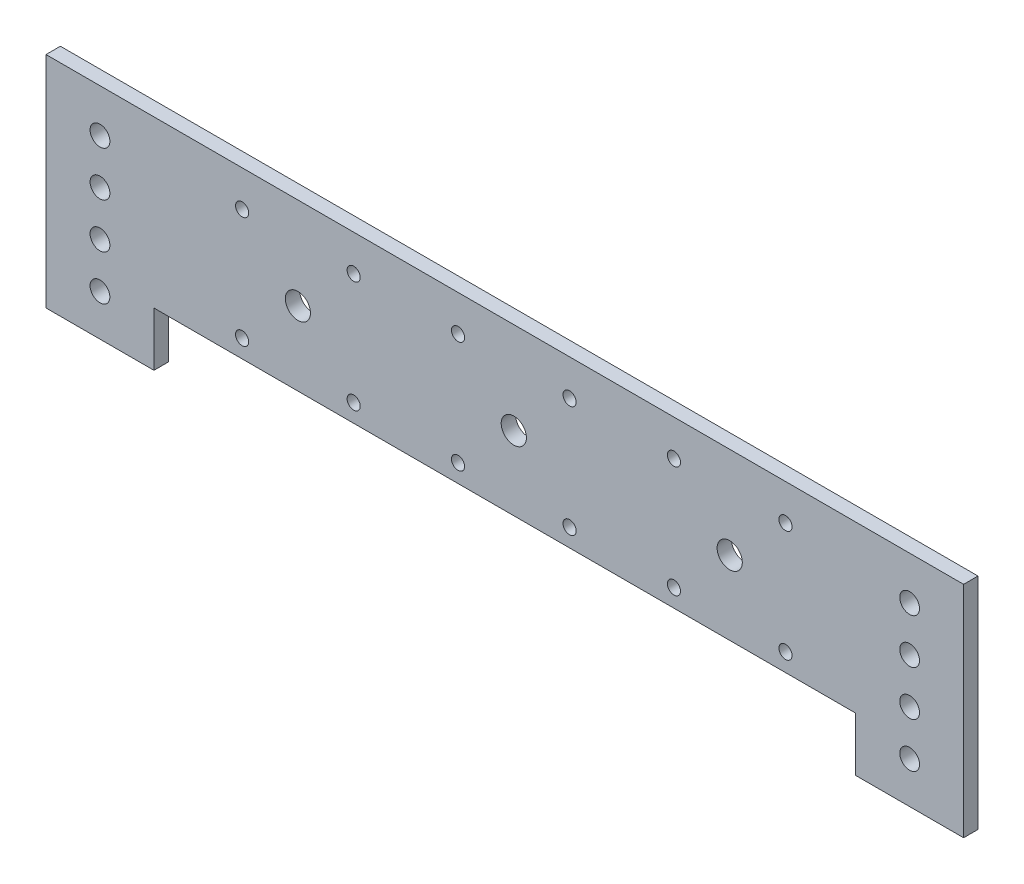
ISO-10303-21;
HEADER;
FILE_DESCRIPTION(('STEP AP214'),'2;1');
FILE_NAME('part.step','',(''),(''),'','','');
FILE_SCHEMA(('AUTOMOTIVE_DESIGN { 1 0 10303 214 1 1 1 1 }'));
ENDSEC;
DATA;
#1=APPLICATION_CONTEXT('core data for automotive mechanical design processes');
#2=APPLICATION_PROTOCOL_DEFINITION('international standard','automotive_design',2000,#1);
#3=PRODUCT_CONTEXT('',#1,'mechanical');
#4=PRODUCT('Part','Part','',(#3));
#5=PRODUCT_RELATED_PRODUCT_CATEGORY('part','',(#4));
#6=PRODUCT_DEFINITION_FORMATION('','',#4);
#7=PRODUCT_DEFINITION_CONTEXT('part definition',#1,'design');
#8=PRODUCT_DEFINITION('design','',#6,#7);
#9=PRODUCT_DEFINITION_SHAPE('','',#8);
#10=(LENGTH_UNIT() NAMED_UNIT(*) SI_UNIT(.MILLI.,.METRE.));
#11=(NAMED_UNIT(*) PLANE_ANGLE_UNIT() SI_UNIT($,.RADIAN.));
#12=(NAMED_UNIT(*) SI_UNIT($,.STERADIAN.) SOLID_ANGLE_UNIT());
#13=UNCERTAINTY_MEASURE_WITH_UNIT(LENGTH_MEASURE(1.E-05),#10,'distance_accuracy_value','');
#14=(GEOMETRIC_REPRESENTATION_CONTEXT(3) GLOBAL_UNCERTAINTY_ASSIGNED_CONTEXT((#13)) GLOBAL_UNIT_ASSIGNED_CONTEXT((#10,
#11,#12)) REPRESENTATION_CONTEXT('',''));
#15=CARTESIAN_POINT('',(0.,0.,0.));
#16=DIRECTION('',(0.,0.,1.));
#17=DIRECTION('',(1.,0.,0.));
#18=AXIS2_PLACEMENT_3D('',#15,#16,#17);
#19=CARTESIAN_POINT('',(0.,-23.,4.));
#20=DIRECTION('',(0.,-1.,0.));
#21=DIRECTION('',(0.,0.,-1.));
#22=AXIS2_PLACEMENT_3D('',#19,#20,#21);
#23=PLANE('',#22);
#24=DIRECTION('',(-1.,0.,0.));
#25=VECTOR('',#24,1.);
#26=CARTESIAN_POINT('',(0.,-23.,0.));
#27=LINE('',#26,#25);
#28=CARTESIAN_POINT('',(95.,-23.,0.));
#29=VERTEX_POINT('',#28);
#30=CARTESIAN_POINT('',(-100.,-23.,0.));
#31=VERTEX_POINT('',#30);
#32=EDGE_CURVE('E54',#29,#31,#27,.T.);
#33=ORIENTED_EDGE('',*,*,#32,.F.);
#34=DIRECTION('',(0.,0.,1.));
#35=VECTOR('',#34,1.);
#36=CARTESIAN_POINT('',(95.,-23.,-78.5573039252239));
#37=LINE('',#36,#35);
#38=CARTESIAN_POINT('',(95.,-23.,4.));
#39=VERTEX_POINT('',#38);
#40=EDGE_CURVE('E121',#29,#39,#37,.T.);
#41=ORIENTED_EDGE('',*,*,#40,.T.);
#42=DIRECTION('',(-1.,0.,0.));
#43=VECTOR('',#42,1.);
#44=CARTESIAN_POINT('',(0.,-23.,4.));
#45=LINE('',#44,#43);
#46=CARTESIAN_POINT('',(-100.,-23.,4.));
#47=VERTEX_POINT('',#46);
#48=EDGE_CURVE('E104',#39,#47,#45,.T.);
#49=ORIENTED_EDGE('',*,*,#48,.T.);
#50=DIRECTION('',(0.,0.,1.));
#51=VECTOR('',#50,1.);
#52=CARTESIAN_POINT('',(-100.,-23.,-78.5573039252239));
#53=LINE('',#52,#51);
#54=EDGE_CURVE('E166',#31,#47,#53,.T.);
#55=ORIENTED_EDGE('',*,*,#54,.F.);
#56=EDGE_LOOP('',(#33,#41,#49,#55));
#57=FACE_BOUND('',#56,.T.);
#58=ADVANCED_FACE('F37',(#57),#23,.T.);
#59=CARTESIAN_POINT('',(75.5,-18.,4.));
#60=DIRECTION('',(0.,0.,-1.));
#61=DIRECTION('',(-1.,0.,0.));
#62=AXIS2_PLACEMENT_3D('',#59,#60,#61);
#63=CYLINDRICAL_SURFACE('',#62,1.82499999999999);
#64=CARTESIAN_POINT('',(75.5,-18.,4.));
#65=DIRECTION('',(0.,0.,1.));
#66=DIRECTION('',(1.,0.,0.));
#67=AXIS2_PLACEMENT_3D('',#64,#65,#66);
#68=CIRCLE('',#67,1.82499999999999);
#69=CARTESIAN_POINT('',(77.325,-18.,4.));
#70=VERTEX_POINT('',#69);
#71=EDGE_CURVE('E46',#70,#70,#68,.F.);
#72=ORIENTED_EDGE('',*,*,#71,.F.);
#73=EDGE_LOOP('',(#72));
#74=FACE_BOUND('',#73,.T.);
#75=CARTESIAN_POINT('',(75.5,-18.,0.));
#76=DIRECTION('',(0.,0.,1.));
#77=DIRECTION('',(1.,0.,0.));
#78=AXIS2_PLACEMENT_3D('',#75,#76,#77);
#79=CIRCLE('',#78,1.82499999999999);
#80=CARTESIAN_POINT('',(77.325,-18.,0.));
#81=VERTEX_POINT('',#80);
#82=EDGE_CURVE('E254',#81,#81,#79,.F.);
#83=ORIENTED_EDGE('',*,*,#82,.T.);
#84=EDGE_LOOP('',(#83));
#85=FACE_BOUND('',#84,.T.);
#86=ADVANCED_FACE('F281',(#74,#85),#63,.F.);
#87=CARTESIAN_POINT('',(60.,-2.49999999999996,4.));
#88=DIRECTION('',(0.,0.,-1.));
#89=DIRECTION('',(-1.,0.,0.));
#90=AXIS2_PLACEMENT_3D('',#87,#88,#89);
#91=CYLINDRICAL_SURFACE('',#90,3.50000000000001);
#92=CARTESIAN_POINT('',(60.,-2.49999999999996,4.));
#93=DIRECTION('',(0.,0.,1.));
#94=DIRECTION('',(1.,0.,0.));
#95=AXIS2_PLACEMENT_3D('',#92,#93,#94);
#96=CIRCLE('',#95,3.50000000000001);
#97=CARTESIAN_POINT('',(63.5,-2.49999999999996,4.));
#98=VERTEX_POINT('',#97);
#99=EDGE_CURVE('E209',#98,#98,#96,.F.);
#100=ORIENTED_EDGE('',*,*,#99,.F.);
#101=EDGE_LOOP('',(#100));
#102=FACE_BOUND('',#101,.T.);
#103=CARTESIAN_POINT('',(60.,-2.49999999999996,0.));
#104=DIRECTION('',(0.,0.,1.));
#105=DIRECTION('',(1.,0.,0.));
#106=AXIS2_PLACEMENT_3D('',#103,#104,#105);
#107=CIRCLE('',#106,3.50000000000001);
#108=CARTESIAN_POINT('',(63.5,-2.49999999999996,0.));
#109=VERTEX_POINT('',#108);
#110=EDGE_CURVE('E252',#109,#109,#107,.F.);
#111=ORIENTED_EDGE('',*,*,#110,.T.);
#112=EDGE_LOOP('',(#111));
#113=FACE_BOUND('',#112,.T.);
#114=ADVANCED_FACE('F286',(#102,#113),#91,.F.);
#115=CARTESIAN_POINT('',(-44.5,-18.,4.));
#116=DIRECTION('',(0.,0.,-1.));
#117=DIRECTION('',(-1.,0.,0.));
#118=AXIS2_PLACEMENT_3D('',#115,#116,#117);
#119=CYLINDRICAL_SURFACE('',#118,1.825);
#120=CARTESIAN_POINT('',(-44.5,-18.,4.));
#121=DIRECTION('',(0.,0.,1.));
#122=DIRECTION('',(1.,0.,0.));
#123=AXIS2_PLACEMENT_3D('',#120,#121,#122);
#124=CIRCLE('',#123,1.825);
#125=CARTESIAN_POINT('',(-42.675,-18.,4.));
#126=VERTEX_POINT('',#125);
#127=EDGE_CURVE('E206',#126,#126,#124,.T.);
#128=ORIENTED_EDGE('',*,*,#127,.T.);
#129=EDGE_LOOP('',(#128));
#130=FACE_BOUND('',#129,.T.);
#131=CARTESIAN_POINT('',(-44.5,-18.,0.));
#132=DIRECTION('',(0.,0.,1.));
#133=DIRECTION('',(1.,0.,0.));
#134=AXIS2_PLACEMENT_3D('',#131,#132,#133);
#135=CIRCLE('',#134,1.825);
#136=CARTESIAN_POINT('',(-42.675,-18.,0.));
#137=VERTEX_POINT('',#136);
#138=EDGE_CURVE('E249',#137,#137,#135,.T.);
#139=ORIENTED_EDGE('',*,*,#138,.F.);
#140=EDGE_LOOP('',(#139));
#141=FACE_BOUND('',#140,.T.);
#142=ADVANCED_FACE('F352',(#130,#141),#119,.F.);
#143=CARTESIAN_POINT('',(-75.5,-18.,4.));
#144=DIRECTION('',(0.,0.,-1.));
#145=DIRECTION('',(-1.,0.,0.));
#146=AXIS2_PLACEMENT_3D('',#143,#144,#145);
#147=CYLINDRICAL_SURFACE('',#146,1.82499999999999);
#148=CARTESIAN_POINT('',(-75.5,-18.,4.));
#149=DIRECTION('',(0.,0.,1.));
#150=DIRECTION('',(1.,0.,0.));
#151=AXIS2_PLACEMENT_3D('',#148,#149,#150);
#152=CIRCLE('',#151,1.82499999999999);
#153=CARTESIAN_POINT('',(-73.675,-18.,4.));
#154=VERTEX_POINT('',#153);
#155=EDGE_CURVE('E203',#154,#154,#152,.T.);
#156=ORIENTED_EDGE('',*,*,#155,.T.);
#157=EDGE_LOOP('',(#156));
#158=FACE_BOUND('',#157,.T.);
#159=CARTESIAN_POINT('',(-75.5,-18.,0.));
#160=DIRECTION('',(0.,0.,1.));
#161=DIRECTION('',(1.,0.,0.));
#162=AXIS2_PLACEMENT_3D('',#159,#160,#161);
#163=CIRCLE('',#162,1.82499999999999);
#164=CARTESIAN_POINT('',(-73.675,-18.,0.));
#165=VERTEX_POINT('',#164);
#166=EDGE_CURVE('E246',#165,#165,#163,.T.);
#167=ORIENTED_EDGE('',*,*,#166,.F.);
#168=EDGE_LOOP('',(#167));
#169=FACE_BOUND('',#168,.T.);
#170=ADVANCED_FACE('F358',(#158,#169),#147,.F.);
#171=CARTESIAN_POINT('',(-44.5,13.,4.));
#172=DIRECTION('',(0.,0.,-1.));
#173=DIRECTION('',(-1.,0.,0.));
#174=AXIS2_PLACEMENT_3D('',#171,#172,#173);
#175=CYLINDRICAL_SURFACE('',#174,1.825);
#176=CARTESIAN_POINT('',(-44.5,13.,4.));
#177=DIRECTION('',(0.,0.,1.));
#178=DIRECTION('',(1.,0.,0.));
#179=AXIS2_PLACEMENT_3D('',#176,#177,#178);
#180=CIRCLE('',#179,1.825);
#181=CARTESIAN_POINT('',(-42.675,13.,4.));
#182=VERTEX_POINT('',#181);
#183=EDGE_CURVE('E200',#182,#182,#180,.T.);
#184=ORIENTED_EDGE('',*,*,#183,.T.);
#185=EDGE_LOOP('',(#184));
#186=FACE_BOUND('',#185,.T.);
#187=CARTESIAN_POINT('',(-44.5,13.,0.));
#188=DIRECTION('',(0.,0.,1.));
#189=DIRECTION('',(1.,0.,0.));
#190=AXIS2_PLACEMENT_3D('',#187,#188,#189);
#191=CIRCLE('',#190,1.825);
#192=CARTESIAN_POINT('',(-42.675,13.,0.));
#193=VERTEX_POINT('',#192);
#194=EDGE_CURVE('E243',#193,#193,#191,.T.);
#195=ORIENTED_EDGE('',*,*,#194,.F.);
#196=EDGE_LOOP('',(#195));
#197=FACE_BOUND('',#196,.T.);
#198=ADVANCED_FACE('F365',(#186,#197),#175,.F.);
#199=CARTESIAN_POINT('',(-75.5,13.,4.));
#200=DIRECTION('',(0.,0.,-1.));
#201=DIRECTION('',(-1.,0.,0.));
#202=AXIS2_PLACEMENT_3D('',#199,#200,#201);
#203=CYLINDRICAL_SURFACE('',#202,1.82499999999999);
#204=CARTESIAN_POINT('',(-75.5,13.,4.));
#205=DIRECTION('',(0.,0.,1.));
#206=DIRECTION('',(1.,0.,0.));
#207=AXIS2_PLACEMENT_3D('',#204,#205,#206);
#208=CIRCLE('',#207,1.82499999999999);
#209=CARTESIAN_POINT('',(-73.675,13.,4.));
#210=VERTEX_POINT('',#209);
#211=EDGE_CURVE('E197',#210,#210,#208,.T.);
#212=ORIENTED_EDGE('',*,*,#211,.T.);
#213=EDGE_LOOP('',(#212));
#214=FACE_BOUND('',#213,.T.);
#215=CARTESIAN_POINT('',(-75.5,13.,0.));
#216=DIRECTION('',(0.,0.,1.));
#217=DIRECTION('',(1.,0.,0.));
#218=AXIS2_PLACEMENT_3D('',#215,#216,#217);
#219=CIRCLE('',#218,1.82499999999999);
#220=CARTESIAN_POINT('',(-73.675,13.,0.));
#221=VERTEX_POINT('',#220);
#222=EDGE_CURVE('E240',#221,#221,#219,.T.);
#223=ORIENTED_EDGE('',*,*,#222,.F.);
#224=EDGE_LOOP('',(#223));
#225=FACE_BOUND('',#224,.T.);
#226=ADVANCED_FACE('F368',(#214,#225),#203,.F.);
#227=CARTESIAN_POINT('',(0.,23.,4.));
#228=DIRECTION('',(0.,-1.,0.));
#229=DIRECTION('',(0.,0.,-1.));
#230=AXIS2_PLACEMENT_3D('',#227,#228,#229);
#231=PLANE('',#230);
#232=DIRECTION('',(-1.,0.,0.));
#233=VECTOR('',#232,1.);
#234=CARTESIAN_POINT('',(0.,23.,0.));
#235=LINE('',#234,#233);
#236=CARTESIAN_POINT('',(125.,23.,0.));
#237=VERTEX_POINT('',#236);
#238=CARTESIAN_POINT('',(-130.,23.,0.));
#239=VERTEX_POINT('',#238);
#240=EDGE_CURVE('E238',#237,#239,#235,.T.);
#241=ORIENTED_EDGE('',*,*,#240,.T.);
#242=DIRECTION('',(0.,0.,1.));
#243=VECTOR('',#242,1.);
#244=CARTESIAN_POINT('',(-130.,23.,-78.5573039252239));
#245=LINE('',#244,#243);
#246=CARTESIAN_POINT('',(-130.,23.,4.));
#247=VERTEX_POINT('',#246);
#248=EDGE_CURVE('E156',#239,#247,#245,.T.);
#249=ORIENTED_EDGE('',*,*,#248,.T.);
#250=DIRECTION('',(-1.,0.,0.));
#251=VECTOR('',#250,1.);
#252=CARTESIAN_POINT('',(0.,23.,4.));
#253=LINE('',#252,#251);
#254=CARTESIAN_POINT('',(125.,23.,4.));
#255=VERTEX_POINT('',#254);
#256=EDGE_CURVE('E117',#255,#247,#253,.T.);
#257=ORIENTED_EDGE('',*,*,#256,.F.);
#258=DIRECTION('',(0.,0.,1.));
#259=VECTOR('',#258,1.);
#260=CARTESIAN_POINT('',(125.,23.,-78.5573039252239));
#261=LINE('',#260,#259);
#262=EDGE_CURVE('E143',#237,#255,#261,.T.);
#263=ORIENTED_EDGE('',*,*,#262,.F.);
#264=EDGE_LOOP('',(#241,#249,#257,#263));
#265=FACE_BOUND('',#264,.T.);
#266=ADVANCED_FACE('F291',(#265),#231,.F.);
#267=CARTESIAN_POINT('',(-15.5,13.,4.));
#268=DIRECTION('',(0.,0.,-1.));
#269=DIRECTION('',(-1.,0.,0.));
#270=AXIS2_PLACEMENT_3D('',#267,#268,#269);
#271=CYLINDRICAL_SURFACE('',#270,1.82499999999999);
#272=CARTESIAN_POINT('',(-15.5,13.,4.));
#273=DIRECTION('',(0.,0.,1.));
#274=DIRECTION('',(1.,0.,0.));
#275=AXIS2_PLACEMENT_3D('',#272,#273,#274);
#276=CIRCLE('',#275,1.82499999999999);
#277=CARTESIAN_POINT('',(-13.675,13.,4.));
#278=VERTEX_POINT('',#277);
#279=EDGE_CURVE('E118',#278,#278,#276,.T.);
#280=ORIENTED_EDGE('',*,*,#279,.T.);
#281=EDGE_LOOP('',(#280));
#282=FACE_BOUND('',#281,.T.);
#283=CARTESIAN_POINT('',(-15.5,13.,0.));
#284=DIRECTION('',(0.,0.,1.));
#285=DIRECTION('',(1.,0.,0.));
#286=AXIS2_PLACEMENT_3D('',#283,#284,#285);
#287=CIRCLE('',#286,1.82499999999999);
#288=CARTESIAN_POINT('',(-13.675,13.,0.));
#289=VERTEX_POINT('',#288);
#290=EDGE_CURVE('E234',#289,#289,#287,.T.);
#291=ORIENTED_EDGE('',*,*,#290,.F.);
#292=EDGE_LOOP('',(#291));
#293=FACE_BOUND('',#292,.T.);
#294=ADVANCED_FACE('F293',(#282,#293),#271,.F.);
#295=CARTESIAN_POINT('',(15.5,13.,4.));
#296=DIRECTION('',(0.,0.,-1.));
#297=DIRECTION('',(-1.,0.,0.));
#298=AXIS2_PLACEMENT_3D('',#295,#296,#297);
#299=CYLINDRICAL_SURFACE('',#298,1.82499999999998);
#300=CARTESIAN_POINT('',(15.5,13.,4.));
#301=DIRECTION('',(0.,0.,1.));
#302=DIRECTION('',(1.,0.,0.));
#303=AXIS2_PLACEMENT_3D('',#300,#301,#302);
#304=CIRCLE('',#303,1.82499999999998);
#305=CARTESIAN_POINT('',(17.325,13.,4.));
#306=VERTEX_POINT('',#305);
#307=EDGE_CURVE('E191',#306,#306,#304,.T.);
#308=ORIENTED_EDGE('',*,*,#307,.T.);
#309=EDGE_LOOP('',(#308));
#310=FACE_BOUND('',#309,.T.);
#311=CARTESIAN_POINT('',(15.5,13.,0.));
#312=DIRECTION('',(0.,0.,1.));
#313=DIRECTION('',(1.,0.,0.));
#314=AXIS2_PLACEMENT_3D('',#311,#312,#313);
#315=CIRCLE('',#314,1.82499999999998);
#316=CARTESIAN_POINT('',(17.325,13.,0.));
#317=VERTEX_POINT('',#316);
#318=EDGE_CURVE('E231',#317,#317,#315,.T.);
#319=ORIENTED_EDGE('',*,*,#318,.F.);
#320=EDGE_LOOP('',(#319));
#321=FACE_BOUND('',#320,.T.);
#322=ADVANCED_FACE('F296',(#310,#321),#299,.F.);
#323=CARTESIAN_POINT('',(-15.5,-18.,4.));
#324=DIRECTION('',(0.,0.,-1.));
#325=DIRECTION('',(-1.,0.,0.));
#326=AXIS2_PLACEMENT_3D('',#323,#324,#325);
#327=CYLINDRICAL_SURFACE('',#326,1.82499999999999);
#328=CARTESIAN_POINT('',(-15.5,-18.,4.));
#329=DIRECTION('',(0.,0.,1.));
#330=DIRECTION('',(1.,0.,0.));
#331=AXIS2_PLACEMENT_3D('',#328,#329,#330);
#332=CIRCLE('',#331,1.82499999999999);
#333=CARTESIAN_POINT('',(-13.675,-18.,4.));
#334=VERTEX_POINT('',#333);
#335=EDGE_CURVE('E188',#334,#334,#332,.T.);
#336=ORIENTED_EDGE('',*,*,#335,.T.);
#337=EDGE_LOOP('',(#336));
#338=FACE_BOUND('',#337,.T.);
#339=CARTESIAN_POINT('',(-15.5,-18.,0.));
#340=DIRECTION('',(0.,0.,1.));
#341=DIRECTION('',(1.,0.,0.));
#342=AXIS2_PLACEMENT_3D('',#339,#340,#341);
#343=CIRCLE('',#342,1.82499999999999);
#344=CARTESIAN_POINT('',(-13.675,-18.,0.));
#345=VERTEX_POINT('',#344);
#346=EDGE_CURVE('E228',#345,#345,#343,.T.);
#347=ORIENTED_EDGE('',*,*,#346,.F.);
#348=EDGE_LOOP('',(#347));
#349=FACE_BOUND('',#348,.T.);
#350=ADVANCED_FACE('F300',(#338,#349),#327,.F.);
#351=CARTESIAN_POINT('',(15.5,-18.,4.));
#352=DIRECTION('',(0.,0.,-1.));
#353=DIRECTION('',(-1.,0.,0.));
#354=AXIS2_PLACEMENT_3D('',#351,#352,#353);
#355=CYLINDRICAL_SURFACE('',#354,1.82499999999998);
#356=CARTESIAN_POINT('',(15.5,-18.,4.));
#357=DIRECTION('',(0.,0.,1.));
#358=DIRECTION('',(1.,0.,0.));
#359=AXIS2_PLACEMENT_3D('',#356,#357,#358);
#360=CIRCLE('',#359,1.82499999999998);
#361=CARTESIAN_POINT('',(17.325,-18.,4.));
#362=VERTEX_POINT('',#361);
#363=EDGE_CURVE('E185',#362,#362,#360,.T.);
#364=ORIENTED_EDGE('',*,*,#363,.T.);
#365=EDGE_LOOP('',(#364));
#366=FACE_BOUND('',#365,.T.);
#367=CARTESIAN_POINT('',(15.5,-18.,0.));
#368=DIRECTION('',(0.,0.,1.));
#369=DIRECTION('',(1.,0.,0.));
#370=AXIS2_PLACEMENT_3D('',#367,#368,#369);
#371=CIRCLE('',#370,1.82499999999998);
#372=CARTESIAN_POINT('',(17.325,-18.,0.));
#373=VERTEX_POINT('',#372);
#374=EDGE_CURVE('E225',#373,#373,#371,.T.);
#375=ORIENTED_EDGE('',*,*,#374,.F.);
#376=EDGE_LOOP('',(#375));
#377=FACE_BOUND('',#376,.T.);
#378=ADVANCED_FACE('F304',(#366,#377),#355,.F.);
#379=CARTESIAN_POINT('',(44.5,-18.,4.));
#380=DIRECTION('',(0.,0.,-1.));
#381=DIRECTION('',(-1.,0.,0.));
#382=AXIS2_PLACEMENT_3D('',#379,#380,#381);
#383=CYLINDRICAL_SURFACE('',#382,1.825);
#384=CARTESIAN_POINT('',(44.5,-18.,4.));
#385=DIRECTION('',(0.,0.,1.));
#386=DIRECTION('',(1.,0.,0.));
#387=AXIS2_PLACEMENT_3D('',#384,#385,#386);
#388=CIRCLE('',#387,1.825);
#389=CARTESIAN_POINT('',(46.325,-18.,4.));
#390=VERTEX_POINT('',#389);
#391=EDGE_CURVE('E182',#390,#390,#388,.F.);
#392=ORIENTED_EDGE('',*,*,#391,.F.);
#393=EDGE_LOOP('',(#392));
#394=FACE_BOUND('',#393,.T.);
#395=CARTESIAN_POINT('',(44.5,-18.,0.));
#396=DIRECTION('',(0.,0.,1.));
#397=DIRECTION('',(1.,0.,0.));
#398=AXIS2_PLACEMENT_3D('',#395,#396,#397);
#399=CIRCLE('',#398,1.825);
#400=CARTESIAN_POINT('',(46.325,-18.,0.));
#401=VERTEX_POINT('',#400);
#402=EDGE_CURVE('E222',#401,#401,#399,.F.);
#403=ORIENTED_EDGE('',*,*,#402,.T.);
#404=EDGE_LOOP('',(#403));
#405=FACE_BOUND('',#404,.T.);
#406=ADVANCED_FACE('F308',(#394,#405),#383,.F.);
#407=CARTESIAN_POINT('',(-60.,-2.5,4.));
#408=DIRECTION('',(0.,0.,-1.));
#409=DIRECTION('',(-1.,0.,0.));
#410=AXIS2_PLACEMENT_3D('',#407,#408,#409);
#411=CYLINDRICAL_SURFACE('',#410,3.50000000000001);
#412=CARTESIAN_POINT('',(-60.,-2.5,4.));
#413=DIRECTION('',(0.,0.,1.));
#414=DIRECTION('',(1.,0.,0.));
#415=AXIS2_PLACEMENT_3D('',#412,#413,#414);
#416=CIRCLE('',#415,3.50000000000001);
#417=CARTESIAN_POINT('',(-56.5,-2.5,4.));
#418=VERTEX_POINT('',#417);
#419=EDGE_CURVE('E179',#418,#418,#416,.T.);
#420=ORIENTED_EDGE('',*,*,#419,.T.);
#421=EDGE_LOOP('',(#420));
#422=FACE_BOUND('',#421,.T.);
#423=CARTESIAN_POINT('',(-60.,-2.5,0.));
#424=DIRECTION('',(0.,0.,1.));
#425=DIRECTION('',(1.,0.,0.));
#426=AXIS2_PLACEMENT_3D('',#423,#424,#425);
#427=CIRCLE('',#426,3.50000000000001);
#428=CARTESIAN_POINT('',(-56.5,-2.5,0.));
#429=VERTEX_POINT('',#428);
#430=EDGE_CURVE('E219',#429,#429,#427,.T.);
#431=ORIENTED_EDGE('',*,*,#430,.F.);
#432=EDGE_LOOP('',(#431));
#433=FACE_BOUND('',#432,.T.);
#434=ADVANCED_FACE('F312',(#422,#433),#411,.F.);
#435=CARTESIAN_POINT('',(0.,-2.50000000000001,4.));
#436=DIRECTION('',(0.,0.,-1.));
#437=DIRECTION('',(-1.,0.,0.));
#438=AXIS2_PLACEMENT_3D('',#435,#436,#437);
#439=CYLINDRICAL_SURFACE('',#438,3.50000000000001);
#440=CARTESIAN_POINT('',(0.,-2.50000000000001,4.));
#441=DIRECTION('',(0.,0.,1.));
#442=DIRECTION('',(1.,0.,0.));
#443=AXIS2_PLACEMENT_3D('',#440,#441,#442);
#444=CIRCLE('',#443,3.50000000000001);
#445=CARTESIAN_POINT('',(3.50000000000001,-2.50000000000001,4.));
#446=VERTEX_POINT('',#445);
#447=EDGE_CURVE('E176',#446,#446,#444,.T.);
#448=ORIENTED_EDGE('',*,*,#447,.T.);
#449=EDGE_LOOP('',(#448));
#450=FACE_BOUND('',#449,.T.);
#451=CARTESIAN_POINT('',(0.,-2.50000000000001,0.));
#452=DIRECTION('',(0.,0.,1.));
#453=DIRECTION('',(1.,0.,0.));
#454=AXIS2_PLACEMENT_3D('',#451,#452,#453);
#455=CIRCLE('',#454,3.50000000000001);
#456=CARTESIAN_POINT('',(3.50000000000001,-2.50000000000001,0.));
#457=VERTEX_POINT('',#456);
#458=EDGE_CURVE('E216',#457,#457,#455,.T.);
#459=ORIENTED_EDGE('',*,*,#458,.F.);
#460=EDGE_LOOP('',(#459));
#461=FACE_BOUND('',#460,.T.);
#462=ADVANCED_FACE('F315',(#450,#461),#439,.F.);
#463=CARTESIAN_POINT('',(44.5,13.,4.));
#464=DIRECTION('',(0.,0.,-1.));
#465=DIRECTION('',(-1.,0.,0.));
#466=AXIS2_PLACEMENT_3D('',#463,#464,#465);
#467=CYLINDRICAL_SURFACE('',#466,1.825);
#468=CARTESIAN_POINT('',(44.5,13.,4.));
#469=DIRECTION('',(0.,0.,1.));
#470=DIRECTION('',(1.,0.,0.));
#471=AXIS2_PLACEMENT_3D('',#468,#469,#470);
#472=CIRCLE('',#471,1.825);
#473=CARTESIAN_POINT('',(46.325,13.,4.));
#474=VERTEX_POINT('',#473);
#475=EDGE_CURVE('E173',#474,#474,#472,.F.);
#476=ORIENTED_EDGE('',*,*,#475,.F.);
#477=EDGE_LOOP('',(#476));
#478=FACE_BOUND('',#477,.T.);
#479=CARTESIAN_POINT('',(44.5,13.,0.));
#480=DIRECTION('',(0.,0.,1.));
#481=DIRECTION('',(1.,0.,0.));
#482=AXIS2_PLACEMENT_3D('',#479,#480,#481);
#483=CIRCLE('',#482,1.825);
#484=CARTESIAN_POINT('',(46.325,13.,0.));
#485=VERTEX_POINT('',#484);
#486=EDGE_CURVE('E172',#485,#485,#483,.F.);
#487=ORIENTED_EDGE('',*,*,#486,.T.);
#488=EDGE_LOOP('',(#487));
#489=FACE_BOUND('',#488,.T.);
#490=ADVANCED_FACE('F39',(#478,#489),#467,.F.);
#491=CARTESIAN_POINT('',(75.5,13.,4.));
#492=DIRECTION('',(0.,0.,-1.));
#493=DIRECTION('',(-1.,0.,0.));
#494=AXIS2_PLACEMENT_3D('',#491,#492,#493);
#495=CYLINDRICAL_SURFACE('',#494,1.82499999999999);
#496=CARTESIAN_POINT('',(75.5,13.,4.));
#497=DIRECTION('',(0.,0.,1.));
#498=DIRECTION('',(1.,0.,0.));
#499=AXIS2_PLACEMENT_3D('',#496,#497,#498);
#500=CIRCLE('',#499,1.82499999999999);
#501=CARTESIAN_POINT('',(77.325,13.,4.));
#502=VERTEX_POINT('',#501);
#503=EDGE_CURVE('E11',#502,#502,#500,.F.);
#504=ORIENTED_EDGE('',*,*,#503,.F.);
#505=EDGE_LOOP('',(#504));
#506=FACE_BOUND('',#505,.T.);
#507=CARTESIAN_POINT('',(75.5,13.,0.));
#508=DIRECTION('',(0.,0.,1.));
#509=DIRECTION('',(1.,0.,0.));
#510=AXIS2_PLACEMENT_3D('',#507,#508,#509);
#511=CIRCLE('',#510,1.82499999999999);
#512=CARTESIAN_POINT('',(77.325,13.,0.));
#513=VERTEX_POINT('',#512);
#514=EDGE_CURVE('E41',#513,#513,#511,.F.);
#515=ORIENTED_EDGE('',*,*,#514,.T.);
#516=EDGE_LOOP('',(#515));
#517=FACE_BOUND('',#516,.T.);
#518=ADVANCED_FACE('F261',(#506,#517),#495,.F.);
#519=CARTESIAN_POINT('',(0.,0.,4.));
#520=DIRECTION('',(0.,0.,1.));
#521=DIRECTION('',(1.,0.,0.));
#522=AXIS2_PLACEMENT_3D('',#519,#520,#521);
#523=PLANE('',#522);
#524=CARTESIAN_POINT('',(-115.,-1.49999999999999,4.));
#525=DIRECTION('',(0.,0.,1.));
#526=DIRECTION('',(1.,0.,0.));
#527=AXIS2_PLACEMENT_3D('',#524,#525,#526);
#528=CIRCLE('',#527,2.74999999999999);
#529=CARTESIAN_POINT('',(-112.25,-1.49999999999999,4.));
#530=VERTEX_POINT('',#529);
#531=EDGE_CURVE('E566',#530,#530,#528,.T.);
#532=ORIENTED_EDGE('',*,*,#531,.F.);
#533=EDGE_LOOP('',(#532));
#534=FACE_BOUND('',#533,.T.);
#535=CARTESIAN_POINT('',(-115.,-26.5,4.));
#536=DIRECTION('',(0.,0.,1.));
#537=DIRECTION('',(1.,0.,0.));
#538=AXIS2_PLACEMENT_3D('',#535,#536,#537);
#539=CIRCLE('',#538,2.74999999999999);
#540=CARTESIAN_POINT('',(-112.25,-26.5,4.));
#541=VERTEX_POINT('',#540);
#542=EDGE_CURVE('E561',#541,#541,#539,.T.);
#543=ORIENTED_EDGE('',*,*,#542,.F.);
#544=EDGE_LOOP('',(#543));
#545=FACE_BOUND('',#544,.T.);
#546=CARTESIAN_POINT('',(110.,-1.49999999999999,4.));
#547=DIRECTION('',(0.,0.,1.));
#548=DIRECTION('',(1.,0.,0.));
#549=AXIS2_PLACEMENT_3D('',#546,#547,#548);
#550=CIRCLE('',#549,2.74999999999999);
#551=CARTESIAN_POINT('',(112.75,-1.49999999999999,4.));
#552=VERTEX_POINT('',#551);
#553=EDGE_CURVE('E555',#552,#552,#550,.T.);
#554=ORIENTED_EDGE('',*,*,#553,.F.);
#555=EDGE_LOOP('',(#554));
#556=FACE_BOUND('',#555,.T.);
#557=CARTESIAN_POINT('',(110.,-26.5,4.));
#558=DIRECTION('',(0.,0.,1.));
#559=DIRECTION('',(1.,0.,0.));
#560=AXIS2_PLACEMENT_3D('',#557,#558,#559);
#561=CIRCLE('',#560,2.74999999999999);
#562=CARTESIAN_POINT('',(112.75,-26.5,4.));
#563=VERTEX_POINT('',#562);
#564=EDGE_CURVE('E549',#563,#563,#561,.T.);
#565=ORIENTED_EDGE('',*,*,#564,.F.);
#566=EDGE_LOOP('',(#565));
#567=FACE_BOUND('',#566,.T.);
#568=CARTESIAN_POINT('',(-115.,11.,4.));
#569=DIRECTION('',(0.,0.,1.));
#570=DIRECTION('',(1.,0.,0.));
#571=AXIS2_PLACEMENT_3D('',#568,#569,#570);
#572=CIRCLE('',#571,2.74999999999999);
#573=CARTESIAN_POINT('',(-112.25,11.,4.));
#574=VERTEX_POINT('',#573);
#575=EDGE_CURVE('E543',#574,#574,#572,.T.);
#576=ORIENTED_EDGE('',*,*,#575,.F.);
#577=EDGE_LOOP('',(#576));
#578=FACE_BOUND('',#577,.T.);
#579=CARTESIAN_POINT('',(110.,11.,4.));
#580=DIRECTION('',(0.,0.,1.));
#581=DIRECTION('',(1.,0.,0.));
#582=AXIS2_PLACEMENT_3D('',#579,#580,#581);
#583=CIRCLE('',#582,2.74999999999999);
#584=CARTESIAN_POINT('',(112.75,11.,4.));
#585=VERTEX_POINT('',#584);
#586=EDGE_CURVE('E537',#585,#585,#583,.T.);
#587=ORIENTED_EDGE('',*,*,#586,.F.);
#588=EDGE_LOOP('',(#587));
#589=FACE_BOUND('',#588,.T.);
#590=CARTESIAN_POINT('',(110.,-14.,4.));
#591=DIRECTION('',(0.,0.,1.));
#592=DIRECTION('',(1.,0.,0.));
#593=AXIS2_PLACEMENT_3D('',#590,#591,#592);
#594=CIRCLE('',#593,2.74999999999999);
#595=CARTESIAN_POINT('',(112.75,-14.,4.));
#596=VERTEX_POINT('',#595);
#597=EDGE_CURVE('E531',#596,#596,#594,.T.);
#598=ORIENTED_EDGE('',*,*,#597,.F.);
#599=EDGE_LOOP('',(#598));
#600=FACE_BOUND('',#599,.T.);
#601=CARTESIAN_POINT('',(-115.,-14.,4.));
#602=DIRECTION('',(0.,0.,1.));
#603=DIRECTION('',(1.,0.,0.));
#604=AXIS2_PLACEMENT_3D('',#601,#602,#603);
#605=CIRCLE('',#604,2.74999999999999);
#606=CARTESIAN_POINT('',(-112.25,-14.,4.));
#607=VERTEX_POINT('',#606);
#608=EDGE_CURVE('E135',#607,#607,#605,.T.);
#609=ORIENTED_EDGE('',*,*,#608,.F.);
#610=EDGE_LOOP('',(#609));
#611=FACE_BOUND('',#610,.T.);
#612=ORIENTED_EDGE('',*,*,#475,.T.);
#613=EDGE_LOOP('',(#612));
#614=FACE_BOUND('',#613,.T.);
#615=ORIENTED_EDGE('',*,*,#447,.F.);
#616=EDGE_LOOP('',(#615));
#617=FACE_BOUND('',#616,.T.);
#618=ORIENTED_EDGE('',*,*,#419,.F.);
#619=EDGE_LOOP('',(#618));
#620=FACE_BOUND('',#619,.T.);
#621=ORIENTED_EDGE('',*,*,#391,.T.);
#622=EDGE_LOOP('',(#621));
#623=FACE_BOUND('',#622,.T.);
#624=ORIENTED_EDGE('',*,*,#363,.F.);
#625=EDGE_LOOP('',(#624));
#626=FACE_BOUND('',#625,.T.);
#627=ORIENTED_EDGE('',*,*,#335,.F.);
#628=EDGE_LOOP('',(#627));
#629=FACE_BOUND('',#628,.T.);
#630=ORIENTED_EDGE('',*,*,#307,.F.);
#631=EDGE_LOOP('',(#630));
#632=FACE_BOUND('',#631,.T.);
#633=ORIENTED_EDGE('',*,*,#279,.F.);
#634=EDGE_LOOP('',(#633));
#635=FACE_BOUND('',#634,.T.);
#636=ORIENTED_EDGE('',*,*,#256,.T.);
#637=DIRECTION('',(0.,1.,0.));
#638=VECTOR('',#637,1.);
#639=CARTESIAN_POINT('',(-130.,0.,4.));
#640=LINE('',#639,#638);
#641=CARTESIAN_POINT('',(-130.,-38.,4.));
#642=VERTEX_POINT('',#641);
#643=EDGE_CURVE('E152',#642,#247,#640,.T.);
#644=ORIENTED_EDGE('',*,*,#643,.F.);
#645=DIRECTION('',(1.,0.,0.));
#646=VECTOR('',#645,1.);
#647=CARTESIAN_POINT('',(0.,-38.,4.));
#648=LINE('',#647,#646);
#649=CARTESIAN_POINT('',(-100.,-38.,4.));
#650=VERTEX_POINT('',#649);
#651=EDGE_CURVE('E160',#642,#650,#648,.T.);
#652=ORIENTED_EDGE('',*,*,#651,.T.);
#653=DIRECTION('',(0.,-1.,0.));
#654=VECTOR('',#653,1.);
#655=CARTESIAN_POINT('',(-100.,0.,4.));
#656=LINE('',#655,#654);
#657=EDGE_CURVE('E113',#47,#650,#656,.T.);
#658=ORIENTED_EDGE('',*,*,#657,.F.);
#659=ORIENTED_EDGE('',*,*,#48,.F.);
#660=DIRECTION('',(0.,-1.,0.));
#661=VECTOR('',#660,1.);
#662=CARTESIAN_POINT('',(95.,0.,4.));
#663=LINE('',#662,#661);
#664=CARTESIAN_POINT('',(95.,-38.,4.));
#665=VERTEX_POINT('',#664);
#666=EDGE_CURVE('E110',#39,#665,#663,.T.);
#667=ORIENTED_EDGE('',*,*,#666,.T.);
#668=DIRECTION('',(-1.,0.,0.));
#669=VECTOR('',#668,1.);
#670=CARTESIAN_POINT('',(0.,-38.,4.));
#671=LINE('',#670,#669);
#672=CARTESIAN_POINT('',(125.,-38.,4.));
#673=VERTEX_POINT('',#672);
#674=EDGE_CURVE('E130',#673,#665,#671,.T.);
#675=ORIENTED_EDGE('',*,*,#674,.F.);
#676=DIRECTION('',(0.,1.,0.));
#677=VECTOR('',#676,1.);
#678=CARTESIAN_POINT('',(125.,0.,4.));
#679=LINE('',#678,#677);
#680=EDGE_CURVE('E125',#673,#255,#679,.T.);
#681=ORIENTED_EDGE('',*,*,#680,.T.);
#682=EDGE_LOOP('',(#636,#644,#652,#658,#659,#667,#675,#681));
#683=FACE_BOUND('',#682,.T.);
#684=ORIENTED_EDGE('',*,*,#211,.F.);
#685=EDGE_LOOP('',(#684));
#686=FACE_BOUND('',#685,.T.);
#687=ORIENTED_EDGE('',*,*,#183,.F.);
#688=EDGE_LOOP('',(#687));
#689=FACE_BOUND('',#688,.T.);
#690=ORIENTED_EDGE('',*,*,#155,.F.);
#691=EDGE_LOOP('',(#690));
#692=FACE_BOUND('',#691,.T.);
#693=ORIENTED_EDGE('',*,*,#127,.F.);
#694=EDGE_LOOP('',(#693));
#695=FACE_BOUND('',#694,.T.);
#696=ORIENTED_EDGE('',*,*,#99,.T.);
#697=EDGE_LOOP('',(#696));
#698=FACE_BOUND('',#697,.T.);
#699=ORIENTED_EDGE('',*,*,#71,.T.);
#700=EDGE_LOOP('',(#699));
#701=FACE_BOUND('',#700,.T.);
#702=ORIENTED_EDGE('',*,*,#503,.T.);
#703=EDGE_LOOP('',(#702));
#704=FACE_BOUND('',#703,.T.);
#705=ADVANCED_FACE('F106',(#534,#545,#556,#567,#578,#589,#600,#611,#614,#617,#620,#623,#626,
#629,#632,#635,#683,#686,#689,#692,#695,#698,#701,#704),#523,.T.);
#706=CARTESIAN_POINT('',(0.,0.,0.));
#707=DIRECTION('',(0.,0.,1.));
#708=DIRECTION('',(1.,0.,0.));
#709=AXIS2_PLACEMENT_3D('',#706,#707,#708);
#710=PLANE('',#709);
#711=CARTESIAN_POINT('',(-115.,-1.49999999999999,0.));
#712=DIRECTION('',(0.,0.,1.));
#713=DIRECTION('',(1.,0.,0.));
#714=AXIS2_PLACEMENT_3D('',#711,#712,#713);
#715=CIRCLE('',#714,2.75);
#716=CARTESIAN_POINT('',(-112.25,-1.49999999999999,0.));
#717=VERTEX_POINT('',#716);
#718=EDGE_CURVE('E564',#717,#717,#715,.T.);
#719=ORIENTED_EDGE('',*,*,#718,.T.);
#720=EDGE_LOOP('',(#719));
#721=FACE_BOUND('',#720,.T.);
#722=CARTESIAN_POINT('',(-115.,-26.5,0.));
#723=DIRECTION('',(0.,0.,1.));
#724=DIRECTION('',(1.,0.,0.));
#725=AXIS2_PLACEMENT_3D('',#722,#723,#724);
#726=CIRCLE('',#725,2.75);
#727=CARTESIAN_POINT('',(-112.25,-26.5,0.));
#728=VERTEX_POINT('',#727);
#729=EDGE_CURVE('E558',#728,#728,#726,.T.);
#730=ORIENTED_EDGE('',*,*,#729,.T.);
#731=EDGE_LOOP('',(#730));
#732=FACE_BOUND('',#731,.T.);
#733=CARTESIAN_POINT('',(110.,-1.49999999999999,0.));
#734=DIRECTION('',(0.,0.,1.));
#735=DIRECTION('',(1.,0.,0.));
#736=AXIS2_PLACEMENT_3D('',#733,#734,#735);
#737=CIRCLE('',#736,2.75);
#738=CARTESIAN_POINT('',(112.75,-1.49999999999999,0.));
#739=VERTEX_POINT('',#738);
#740=EDGE_CURVE('E552',#739,#739,#737,.T.);
#741=ORIENTED_EDGE('',*,*,#740,.T.);
#742=EDGE_LOOP('',(#741));
#743=FACE_BOUND('',#742,.T.);
#744=CARTESIAN_POINT('',(110.,-26.5,0.));
#745=DIRECTION('',(0.,0.,1.));
#746=DIRECTION('',(1.,0.,0.));
#747=AXIS2_PLACEMENT_3D('',#744,#745,#746);
#748=CIRCLE('',#747,2.75);
#749=CARTESIAN_POINT('',(112.75,-26.5,0.));
#750=VERTEX_POINT('',#749);
#751=EDGE_CURVE('E546',#750,#750,#748,.T.);
#752=ORIENTED_EDGE('',*,*,#751,.T.);
#753=EDGE_LOOP('',(#752));
#754=FACE_BOUND('',#753,.T.);
#755=CARTESIAN_POINT('',(-115.,11.,0.));
#756=DIRECTION('',(0.,0.,1.));
#757=DIRECTION('',(1.,0.,0.));
#758=AXIS2_PLACEMENT_3D('',#755,#756,#757);
#759=CIRCLE('',#758,2.75);
#760=CARTESIAN_POINT('',(-112.25,11.,0.));
#761=VERTEX_POINT('',#760);
#762=EDGE_CURVE('E540',#761,#761,#759,.T.);
#763=ORIENTED_EDGE('',*,*,#762,.T.);
#764=EDGE_LOOP('',(#763));
#765=FACE_BOUND('',#764,.T.);
#766=CARTESIAN_POINT('',(110.,11.,0.));
#767=DIRECTION('',(0.,0.,1.));
#768=DIRECTION('',(1.,0.,0.));
#769=AXIS2_PLACEMENT_3D('',#766,#767,#768);
#770=CIRCLE('',#769,2.75);
#771=CARTESIAN_POINT('',(112.75,11.,0.));
#772=VERTEX_POINT('',#771);
#773=EDGE_CURVE('E534',#772,#772,#770,.T.);
#774=ORIENTED_EDGE('',*,*,#773,.T.);
#775=EDGE_LOOP('',(#774));
#776=FACE_BOUND('',#775,.T.);
#777=CARTESIAN_POINT('',(110.,-14.,0.));
#778=DIRECTION('',(0.,0.,1.));
#779=DIRECTION('',(1.,0.,0.));
#780=AXIS2_PLACEMENT_3D('',#777,#778,#779);
#781=CIRCLE('',#780,2.75);
#782=CARTESIAN_POINT('',(112.75,-14.,0.));
#783=VERTEX_POINT('',#782);
#784=EDGE_CURVE('E528',#783,#783,#781,.T.);
#785=ORIENTED_EDGE('',*,*,#784,.T.);
#786=EDGE_LOOP('',(#785));
#787=FACE_BOUND('',#786,.T.);
#788=CARTESIAN_POINT('',(-115.,-14.,0.));
#789=DIRECTION('',(0.,0.,1.));
#790=DIRECTION('',(1.,0.,0.));
#791=AXIS2_PLACEMENT_3D('',#788,#789,#790);
#792=CIRCLE('',#791,2.75);
#793=CARTESIAN_POINT('',(-112.25,-14.,0.));
#794=VERTEX_POINT('',#793);
#795=EDGE_CURVE('E131',#794,#794,#792,.T.);
#796=ORIENTED_EDGE('',*,*,#795,.T.);
#797=EDGE_LOOP('',(#796));
#798=FACE_BOUND('',#797,.T.);
#799=ORIENTED_EDGE('',*,*,#486,.F.);
#800=EDGE_LOOP('',(#799));
#801=FACE_BOUND('',#800,.T.);
#802=ORIENTED_EDGE('',*,*,#458,.T.);
#803=EDGE_LOOP('',(#802));
#804=FACE_BOUND('',#803,.T.);
#805=ORIENTED_EDGE('',*,*,#430,.T.);
#806=EDGE_LOOP('',(#805));
#807=FACE_BOUND('',#806,.T.);
#808=ORIENTED_EDGE('',*,*,#402,.F.);
#809=EDGE_LOOP('',(#808));
#810=FACE_BOUND('',#809,.T.);
#811=ORIENTED_EDGE('',*,*,#374,.T.);
#812=EDGE_LOOP('',(#811));
#813=FACE_BOUND('',#812,.T.);
#814=ORIENTED_EDGE('',*,*,#346,.T.);
#815=EDGE_LOOP('',(#814));
#816=FACE_BOUND('',#815,.T.);
#817=ORIENTED_EDGE('',*,*,#318,.T.);
#818=EDGE_LOOP('',(#817));
#819=FACE_BOUND('',#818,.T.);
#820=ORIENTED_EDGE('',*,*,#290,.T.);
#821=EDGE_LOOP('',(#820));
#822=FACE_BOUND('',#821,.T.);
#823=ORIENTED_EDGE('',*,*,#32,.T.);
#824=DIRECTION('',(0.,1.,0.));
#825=VECTOR('',#824,1.);
#826=CARTESIAN_POINT('',(-100.,0.,0.));
#827=LINE('',#826,#825);
#828=CARTESIAN_POINT('',(-100.,-38.,0.));
#829=VERTEX_POINT('',#828);
#830=EDGE_CURVE('E153',#829,#31,#827,.T.);
#831=ORIENTED_EDGE('',*,*,#830,.F.);
#832=DIRECTION('',(-1.,0.,0.));
#833=VECTOR('',#832,1.);
#834=CARTESIAN_POINT('',(0.,-38.,0.));
#835=LINE('',#834,#833);
#836=CARTESIAN_POINT('',(-130.,-38.,0.));
#837=VERTEX_POINT('',#836);
#838=EDGE_CURVE('E60',#829,#837,#835,.T.);
#839=ORIENTED_EDGE('',*,*,#838,.T.);
#840=DIRECTION('',(0.,-1.,0.));
#841=VECTOR('',#840,1.);
#842=CARTESIAN_POINT('',(-130.,0.,0.));
#843=LINE('',#842,#841);
#844=EDGE_CURVE('E155',#239,#837,#843,.T.);
#845=ORIENTED_EDGE('',*,*,#844,.F.);
#846=ORIENTED_EDGE('',*,*,#240,.F.);
#847=DIRECTION('',(0.,-1.,0.));
#848=VECTOR('',#847,1.);
#849=CARTESIAN_POINT('',(125.,0.,0.));
#850=LINE('',#849,#848);
#851=CARTESIAN_POINT('',(125.,-38.,0.));
#852=VERTEX_POINT('',#851);
#853=EDGE_CURVE('E138',#237,#852,#850,.T.);
#854=ORIENTED_EDGE('',*,*,#853,.T.);
#855=DIRECTION('',(1.,0.,0.));
#856=VECTOR('',#855,1.);
#857=CARTESIAN_POINT('',(0.,-38.,0.));
#858=LINE('',#857,#856);
#859=CARTESIAN_POINT('',(95.,-38.,0.));
#860=VERTEX_POINT('',#859);
#861=EDGE_CURVE('E146',#860,#852,#858,.T.);
#862=ORIENTED_EDGE('',*,*,#861,.F.);
#863=DIRECTION('',(0.,1.,0.));
#864=VECTOR('',#863,1.);
#865=CARTESIAN_POINT('',(95.,0.,0.));
#866=LINE('',#865,#864);
#867=EDGE_CURVE('E150',#860,#29,#866,.T.);
#868=ORIENTED_EDGE('',*,*,#867,.T.);
#869=EDGE_LOOP('',(#823,#831,#839,#845,#846,#854,#862,#868));
#870=FACE_BOUND('',#869,.T.);
#871=ORIENTED_EDGE('',*,*,#222,.T.);
#872=EDGE_LOOP('',(#871));
#873=FACE_BOUND('',#872,.T.);
#874=ORIENTED_EDGE('',*,*,#194,.T.);
#875=EDGE_LOOP('',(#874));
#876=FACE_BOUND('',#875,.T.);
#877=ORIENTED_EDGE('',*,*,#166,.T.);
#878=EDGE_LOOP('',(#877));
#879=FACE_BOUND('',#878,.T.);
#880=ORIENTED_EDGE('',*,*,#138,.T.);
#881=EDGE_LOOP('',(#880));
#882=FACE_BOUND('',#881,.T.);
#883=ORIENTED_EDGE('',*,*,#110,.F.);
#884=EDGE_LOOP('',(#883));
#885=FACE_BOUND('',#884,.T.);
#886=ORIENTED_EDGE('',*,*,#82,.F.);
#887=EDGE_LOOP('',(#886));
#888=FACE_BOUND('',#887,.T.);
#889=ORIENTED_EDGE('',*,*,#514,.F.);
#890=EDGE_LOOP('',(#889));
#891=FACE_BOUND('',#890,.T.);
#892=ADVANCED_FACE('F263',(#721,#732,#743,#754,#765,#776,#787,#798,#801,#804,#807,#810,#813,
#816,#819,#822,#870,#873,#876,#879,#882,#885,#888,#891),#710,.F.);
#893=CARTESIAN_POINT('',(-130.,0.,-78.5573039252239));
#894=DIRECTION('',(1.,0.,0.));
#895=DIRECTION('',(0.,0.,-1.));
#896=AXIS2_PLACEMENT_3D('',#893,#894,#895);
#897=PLANE('',#896);
#898=ORIENTED_EDGE('',*,*,#248,.F.);
#899=ORIENTED_EDGE('',*,*,#844,.T.);
#900=DIRECTION('',(0.,0.,1.));
#901=VECTOR('',#900,1.);
#902=CARTESIAN_POINT('',(-130.,-38.,-78.5573039252239));
#903=LINE('',#902,#901);
#904=EDGE_CURVE('E163',#837,#642,#903,.T.);
#905=ORIENTED_EDGE('',*,*,#904,.T.);
#906=ORIENTED_EDGE('',*,*,#643,.T.);
#907=EDGE_LOOP('',(#898,#899,#905,#906));
#908=FACE_BOUND('',#907,.T.);
#909=ADVANCED_FACE('F265',(#908),#897,.F.);
#910=CARTESIAN_POINT('',(-100.,0.,-78.5573039252239));
#911=DIRECTION('',(-1.,0.,0.));
#912=DIRECTION('',(0.,0.,1.));
#913=AXIS2_PLACEMENT_3D('',#910,#911,#912);
#914=PLANE('',#913);
#915=DIRECTION('',(0.,0.,1.));
#916=VECTOR('',#915,1.);
#917=CARTESIAN_POINT('',(-100.,-38.,-78.5573039252239));
#918=LINE('',#917,#916);
#919=EDGE_CURVE('E168',#829,#650,#918,.T.);
#920=ORIENTED_EDGE('',*,*,#919,.F.);
#921=ORIENTED_EDGE('',*,*,#830,.T.);
#922=ORIENTED_EDGE('',*,*,#54,.T.);
#923=ORIENTED_EDGE('',*,*,#657,.T.);
#924=EDGE_LOOP('',(#920,#921,#922,#923));
#925=FACE_BOUND('',#924,.T.);
#926=ADVANCED_FACE('F272',(#925),#914,.F.);
#927=CARTESIAN_POINT('',(0.,-38.,-78.5573039252239));
#928=DIRECTION('',(0.,-1.,0.));
#929=DIRECTION('',(0.,0.,-1.));
#930=AXIS2_PLACEMENT_3D('',#927,#928,#929);
#931=PLANE('',#930);
#932=ORIENTED_EDGE('',*,*,#838,.F.);
#933=ORIENTED_EDGE('',*,*,#919,.T.);
#934=ORIENTED_EDGE('',*,*,#651,.F.);
#935=ORIENTED_EDGE('',*,*,#904,.F.);
#936=EDGE_LOOP('',(#932,#933,#934,#935));
#937=FACE_BOUND('',#936,.T.);
#938=ADVANCED_FACE('F502',(#937),#931,.T.);
#939=CARTESIAN_POINT('',(125.,0.,-78.5573039252239));
#940=DIRECTION('',(1.,0.,0.));
#941=DIRECTION('',(0.,0.,-1.));
#942=AXIS2_PLACEMENT_3D('',#939,#940,#941);
#943=PLANE('',#942);
#944=ORIENTED_EDGE('',*,*,#853,.F.);
#945=ORIENTED_EDGE('',*,*,#262,.T.);
#946=ORIENTED_EDGE('',*,*,#680,.F.);
#947=DIRECTION('',(0.,0.,1.));
#948=VECTOR('',#947,1.);
#949=CARTESIAN_POINT('',(125.,-38.,-78.5573039252239));
#950=LINE('',#949,#948);
#951=EDGE_CURVE('E147',#852,#673,#950,.T.);
#952=ORIENTED_EDGE('',*,*,#951,.F.);
#953=EDGE_LOOP('',(#944,#945,#946,#952));
#954=FACE_BOUND('',#953,.T.);
#955=ADVANCED_FACE('F498',(#954),#943,.T.);
#956=CARTESIAN_POINT('',(0.,-38.,-78.5573039252239));
#957=DIRECTION('',(0.,1.,0.));
#958=DIRECTION('',(-1.,0.,0.));
#959=AXIS2_PLACEMENT_3D('',#956,#957,#958);
#960=PLANE('',#959);
#961=DIRECTION('',(0.,0.,1.));
#962=VECTOR('',#961,1.);
#963=CARTESIAN_POINT('',(95.,-38.,-78.5573039252239));
#964=LINE('',#963,#962);
#965=EDGE_CURVE('E124',#860,#665,#964,.T.);
#966=ORIENTED_EDGE('',*,*,#965,.F.);
#967=ORIENTED_EDGE('',*,*,#861,.T.);
#968=ORIENTED_EDGE('',*,*,#951,.T.);
#969=ORIENTED_EDGE('',*,*,#674,.T.);
#970=EDGE_LOOP('',(#966,#967,#968,#969));
#971=FACE_BOUND('',#970,.T.);
#972=ADVANCED_FACE('F501',(#971),#960,.F.);
#973=CARTESIAN_POINT('',(95.,0.,-78.5573039252239));
#974=DIRECTION('',(-1.,0.,0.));
#975=DIRECTION('',(0.,0.,1.));
#976=AXIS2_PLACEMENT_3D('',#973,#974,#975);
#977=PLANE('',#976);
#978=ORIENTED_EDGE('',*,*,#867,.F.);
#979=ORIENTED_EDGE('',*,*,#965,.T.);
#980=ORIENTED_EDGE('',*,*,#666,.F.);
#981=ORIENTED_EDGE('',*,*,#40,.F.);
#982=EDGE_LOOP('',(#978,#979,#980,#981));
#983=FACE_BOUND('',#982,.T.);
#984=ADVANCED_FACE('F127',(#983),#977,.T.);
#985=CARTESIAN_POINT('',(-115.,-14.,4.));
#986=DIRECTION('',(0.,0.,1.));
#987=DIRECTION('',(1.,0.,0.));
#988=AXIS2_PLACEMENT_3D('',#985,#986,#987);
#989=CYLINDRICAL_SURFACE('',#988,2.75);
#990=ORIENTED_EDGE('',*,*,#795,.F.);
#991=EDGE_LOOP('',(#990));
#992=FACE_BOUND('',#991,.T.);
#993=ORIENTED_EDGE('',*,*,#608,.T.);
#994=EDGE_LOOP('',(#993));
#995=FACE_BOUND('',#994,.T.);
#996=ADVANCED_FACE('F416',(#992,#995),#989,.F.);
#997=CARTESIAN_POINT('',(110.,-14.,4.));
#998=DIRECTION('',(0.,0.,1.));
#999=DIRECTION('',(1.,0.,0.));
#1000=AXIS2_PLACEMENT_3D('',#997,#998,#999);
#1001=CYLINDRICAL_SURFACE('',#1000,2.75);
#1002=ORIENTED_EDGE('',*,*,#784,.F.);
#1003=EDGE_LOOP('',(#1002));
#1004=FACE_BOUND('',#1003,.T.);
#1005=ORIENTED_EDGE('',*,*,#597,.T.);
#1006=EDGE_LOOP('',(#1005));
#1007=FACE_BOUND('',#1006,.T.);
#1008=ADVANCED_FACE('F421',(#1004,#1007),#1001,.F.);
#1009=CARTESIAN_POINT('',(110.,11.,4.));
#1010=DIRECTION('',(0.,0.,1.));
#1011=DIRECTION('',(1.,0.,0.));
#1012=AXIS2_PLACEMENT_3D('',#1009,#1010,#1011);
#1013=CYLINDRICAL_SURFACE('',#1012,2.75);
#1014=ORIENTED_EDGE('',*,*,#773,.F.);
#1015=EDGE_LOOP('',(#1014));
#1016=FACE_BOUND('',#1015,.T.);
#1017=ORIENTED_EDGE('',*,*,#586,.T.);
#1018=EDGE_LOOP('',(#1017));
#1019=FACE_BOUND('',#1018,.T.);
#1020=ADVANCED_FACE('F431',(#1016,#1019),#1013,.F.);
#1021=CARTESIAN_POINT('',(-115.,11.,4.));
#1022=DIRECTION('',(0.,0.,1.));
#1023=DIRECTION('',(1.,0.,0.));
#1024=AXIS2_PLACEMENT_3D('',#1021,#1022,#1023);
#1025=CYLINDRICAL_SURFACE('',#1024,2.75);
#1026=ORIENTED_EDGE('',*,*,#762,.F.);
#1027=EDGE_LOOP('',(#1026));
#1028=FACE_BOUND('',#1027,.T.);
#1029=ORIENTED_EDGE('',*,*,#575,.T.);
#1030=EDGE_LOOP('',(#1029));
#1031=FACE_BOUND('',#1030,.T.);
#1032=ADVANCED_FACE('F441',(#1028,#1031),#1025,.F.);
#1033=CARTESIAN_POINT('',(110.,-26.5,4.));
#1034=DIRECTION('',(0.,0.,1.));
#1035=DIRECTION('',(1.,0.,0.));
#1036=AXIS2_PLACEMENT_3D('',#1033,#1034,#1035);
#1037=CYLINDRICAL_SURFACE('',#1036,2.75);
#1038=ORIENTED_EDGE('',*,*,#751,.F.);
#1039=EDGE_LOOP('',(#1038));
#1040=FACE_BOUND('',#1039,.T.);
#1041=ORIENTED_EDGE('',*,*,#564,.T.);
#1042=EDGE_LOOP('',(#1041));
#1043=FACE_BOUND('',#1042,.T.);
#1044=ADVANCED_FACE('F451',(#1040,#1043),#1037,.F.);
#1045=CARTESIAN_POINT('',(110.,-1.49999999999999,4.));
#1046=DIRECTION('',(0.,0.,1.));
#1047=DIRECTION('',(1.,0.,0.));
#1048=AXIS2_PLACEMENT_3D('',#1045,#1046,#1047);
#1049=CYLINDRICAL_SURFACE('',#1048,2.75);
#1050=ORIENTED_EDGE('',*,*,#740,.F.);
#1051=EDGE_LOOP('',(#1050));
#1052=FACE_BOUND('',#1051,.T.);
#1053=ORIENTED_EDGE('',*,*,#553,.T.);
#1054=EDGE_LOOP('',(#1053));
#1055=FACE_BOUND('',#1054,.T.);
#1056=ADVANCED_FACE('F461',(#1052,#1055),#1049,.F.);
#1057=CARTESIAN_POINT('',(-115.,-26.5,4.));
#1058=DIRECTION('',(0.,0.,1.));
#1059=DIRECTION('',(1.,0.,0.));
#1060=AXIS2_PLACEMENT_3D('',#1057,#1058,#1059);
#1061=CYLINDRICAL_SURFACE('',#1060,2.75);
#1062=ORIENTED_EDGE('',*,*,#729,.F.);
#1063=EDGE_LOOP('',(#1062));
#1064=FACE_BOUND('',#1063,.T.);
#1065=ORIENTED_EDGE('',*,*,#542,.T.);
#1066=EDGE_LOOP('',(#1065));
#1067=FACE_BOUND('',#1066,.T.);
#1068=ADVANCED_FACE('F471',(#1064,#1067),#1061,.F.);
#1069=CARTESIAN_POINT('',(-115.,-1.49999999999999,4.));
#1070=DIRECTION('',(0.,0.,1.));
#1071=DIRECTION('',(1.,0.,0.));
#1072=AXIS2_PLACEMENT_3D('',#1069,#1070,#1071);
#1073=CYLINDRICAL_SURFACE('',#1072,2.75);
#1074=ORIENTED_EDGE('',*,*,#718,.F.);
#1075=EDGE_LOOP('',(#1074));
#1076=FACE_BOUND('',#1075,.T.);
#1077=ORIENTED_EDGE('',*,*,#531,.T.);
#1078=EDGE_LOOP('',(#1077));
#1079=FACE_BOUND('',#1078,.T.);
#1080=ADVANCED_FACE('F481',(#1076,#1079),#1073,.F.);
#1081=CLOSED_SHELL('',(#58,#86,#114,#142,#170,#198,#226,#266,#294,#322,#350,#378,#406,#434,#462,
#490,#518,#705,#892,#909,#926,#938,#955,#972,#984,#996,#1008,#1020,#1032,#1044,#1056,#1068,#1080));
#1082=MANIFOLD_SOLID_BREP('B2',#1081);
#1083=ADVANCED_BREP_SHAPE_REPRESENTATION('',(#18,#1082),#14);
#1084=SHAPE_DEFINITION_REPRESENTATION(#9,#1083);
ENDSEC;
END-ISO-10303-21;
